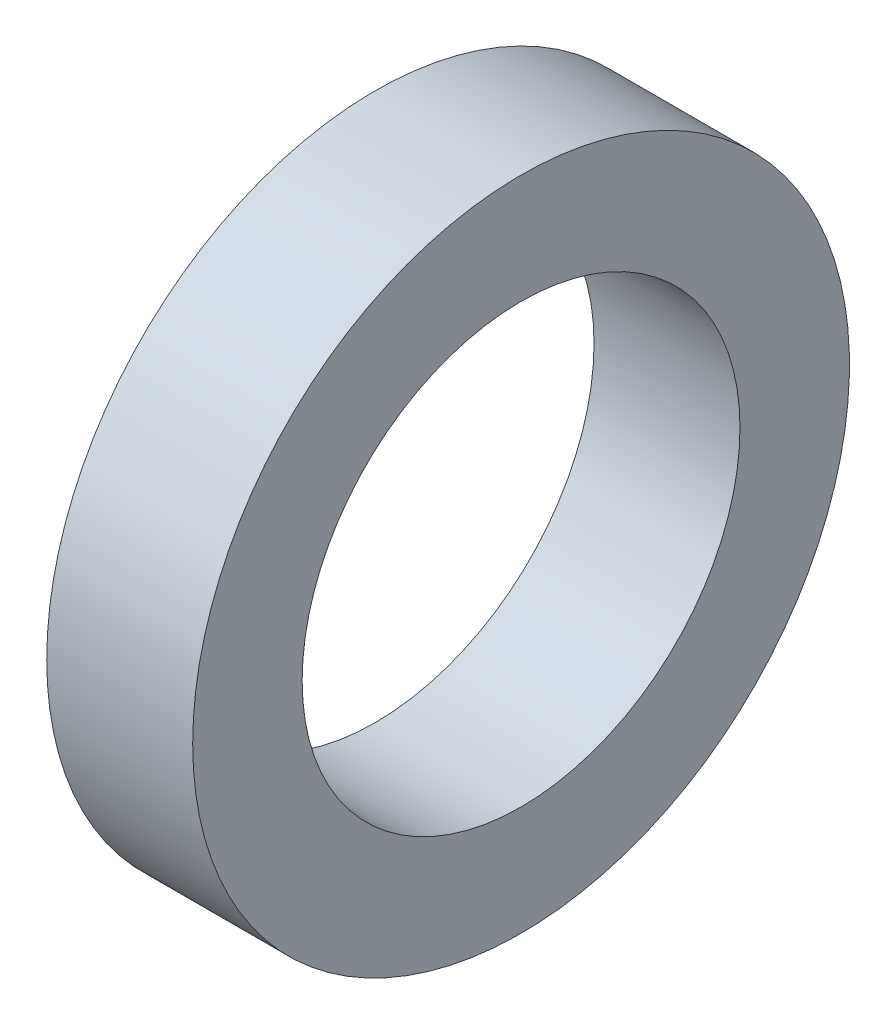
ISO-10303-21;
HEADER;
FILE_DESCRIPTION(('STEP AP214'),'2;1');
FILE_NAME('part.step','',(''),(''),'','','');
FILE_SCHEMA(('AUTOMOTIVE_DESIGN { 1 0 10303 214 1 1 1 1 }'));
ENDSEC;
DATA;
#1=APPLICATION_CONTEXT('core data for automotive mechanical design processes');
#2=APPLICATION_PROTOCOL_DEFINITION('international standard','automotive_design',2000,#1);
#3=PRODUCT_CONTEXT('',#1,'mechanical');
#4=PRODUCT('Part','Part','',(#3));
#5=PRODUCT_RELATED_PRODUCT_CATEGORY('part','',(#4));
#6=PRODUCT_DEFINITION_FORMATION('','',#4);
#7=PRODUCT_DEFINITION_CONTEXT('part definition',#1,'design');
#8=PRODUCT_DEFINITION('design','',#6,#7);
#9=PRODUCT_DEFINITION_SHAPE('','',#8);
#10=(LENGTH_UNIT() NAMED_UNIT(*) SI_UNIT(.MILLI.,.METRE.));
#11=(NAMED_UNIT(*) PLANE_ANGLE_UNIT() SI_UNIT($,.RADIAN.));
#12=(NAMED_UNIT(*) SI_UNIT($,.STERADIAN.) SOLID_ANGLE_UNIT());
#13=UNCERTAINTY_MEASURE_WITH_UNIT(LENGTH_MEASURE(1.E-05),#10,'distance_accuracy_value','');
#14=(GEOMETRIC_REPRESENTATION_CONTEXT(3) GLOBAL_UNCERTAINTY_ASSIGNED_CONTEXT((#13)) GLOBAL_UNIT_ASSIGNED_CONTEXT((#10,
#11,#12)) REPRESENTATION_CONTEXT('',''));
#15=CARTESIAN_POINT('',(0.,0.,0.));
#16=DIRECTION('',(0.,0.,1.));
#17=DIRECTION('',(1.,0.,0.));
#18=AXIS2_PLACEMENT_3D('',#15,#16,#17);
#19=CARTESIAN_POINT('',(0.,9.,0.));
#20=DIRECTION('',(1.,0.,0.));
#21=DIRECTION('',(0.,0.,-1.));
#22=AXIS2_PLACEMENT_3D('',#19,#20,#21);
#23=PLANE('',#22);
#24=CARTESIAN_POINT('',(0.,0.,0.));
#25=DIRECTION('',(-1.,0.,0.));
#26=DIRECTION('',(0.,0.,1.));
#27=AXIS2_PLACEMENT_3D('',#24,#25,#26);
#28=CIRCLE('',#27,6.);
#29=CARTESIAN_POINT('',(0.,0.,6.));
#30=VERTEX_POINT('',#29);
#31=EDGE_CURVE('E10',#30,#30,#28,.T.);
#32=ORIENTED_EDGE('',*,*,#31,.F.);
#33=EDGE_LOOP('',(#32));
#34=FACE_BOUND('',#33,.T.);
#35=CARTESIAN_POINT('',(0.,0.,0.));
#36=DIRECTION('',(-1.,0.,0.));
#37=DIRECTION('',(0.,0.,1.));
#38=AXIS2_PLACEMENT_3D('',#35,#36,#37);
#39=CIRCLE('',#38,9.);
#40=CARTESIAN_POINT('',(0.,0.,9.));
#41=VERTEX_POINT('',#40);
#42=EDGE_CURVE('E58',#41,#41,#39,.T.);
#43=ORIENTED_EDGE('',*,*,#42,.T.);
#44=EDGE_LOOP('',(#43));
#45=FACE_BOUND('',#44,.T.);
#46=ADVANCED_FACE('F41',(#34,#45),#23,.F.);
#47=CARTESIAN_POINT('',(0.,0.,0.));
#48=DIRECTION('',(-1.,0.,0.));
#49=DIRECTION('',(0.,0.,1.));
#50=AXIS2_PLACEMENT_3D('',#47,#48,#49);
#51=CYLINDRICAL_SURFACE('',#50,6.);
#52=CARTESIAN_POINT('',(4.,0.,0.));
#53=DIRECTION('',(-1.,0.,0.));
#54=DIRECTION('',(0.,0.,1.));
#55=AXIS2_PLACEMENT_3D('',#52,#53,#54);
#56=CIRCLE('',#55,6.);
#57=CARTESIAN_POINT('',(4.,0.,6.));
#58=VERTEX_POINT('',#57);
#59=EDGE_CURVE('E48',#58,#58,#56,.T.);
#60=ORIENTED_EDGE('',*,*,#59,.F.);
#61=EDGE_LOOP('',(#60));
#62=FACE_BOUND('',#61,.T.);
#63=ORIENTED_EDGE('',*,*,#31,.T.);
#64=EDGE_LOOP('',(#63));
#65=FACE_BOUND('',#64,.T.);
#66=ADVANCED_FACE('F74',(#62,#65),#51,.F.);
#67=CARTESIAN_POINT('',(4.,9.,0.));
#68=DIRECTION('',(-1.,0.,0.));
#69=DIRECTION('',(0.,0.,1.));
#70=AXIS2_PLACEMENT_3D('',#67,#68,#69);
#71=PLANE('',#70);
#72=CARTESIAN_POINT('',(4.,0.,0.));
#73=DIRECTION('',(-1.,0.,0.));
#74=DIRECTION('',(0.,0.,1.));
#75=AXIS2_PLACEMENT_3D('',#72,#73,#74);
#76=CIRCLE('',#75,9.);
#77=CARTESIAN_POINT('',(4.,0.,9.));
#78=VERTEX_POINT('',#77);
#79=EDGE_CURVE('E53',#78,#78,#76,.T.);
#80=ORIENTED_EDGE('',*,*,#79,.F.);
#81=EDGE_LOOP('',(#80));
#82=FACE_BOUND('',#81,.T.);
#83=ORIENTED_EDGE('',*,*,#59,.T.);
#84=EDGE_LOOP('',(#83));
#85=FACE_BOUND('',#84,.T.);
#86=ADVANCED_FACE('F69',(#82,#85),#71,.F.);
#87=CARTESIAN_POINT('',(0.,0.,0.));
#88=DIRECTION('',(-1.,0.,0.));
#89=DIRECTION('',(0.,0.,1.));
#90=AXIS2_PLACEMENT_3D('',#87,#88,#89);
#91=CYLINDRICAL_SURFACE('',#90,9.);
#92=ORIENTED_EDGE('',*,*,#42,.F.);
#93=EDGE_LOOP('',(#92));
#94=FACE_BOUND('',#93,.T.);
#95=ORIENTED_EDGE('',*,*,#79,.T.);
#96=EDGE_LOOP('',(#95));
#97=FACE_BOUND('',#96,.T.);
#98=ADVANCED_FACE('F66',(#94,#97),#91,.T.);
#99=CLOSED_SHELL('',(#46,#66,#86,#98));
#100=MANIFOLD_SOLID_BREP('B2',#99);
#101=ADVANCED_BREP_SHAPE_REPRESENTATION('',(#18,#100),#14);
#102=SHAPE_DEFINITION_REPRESENTATION(#9,#101);
ENDSEC;
END-ISO-10303-21;
